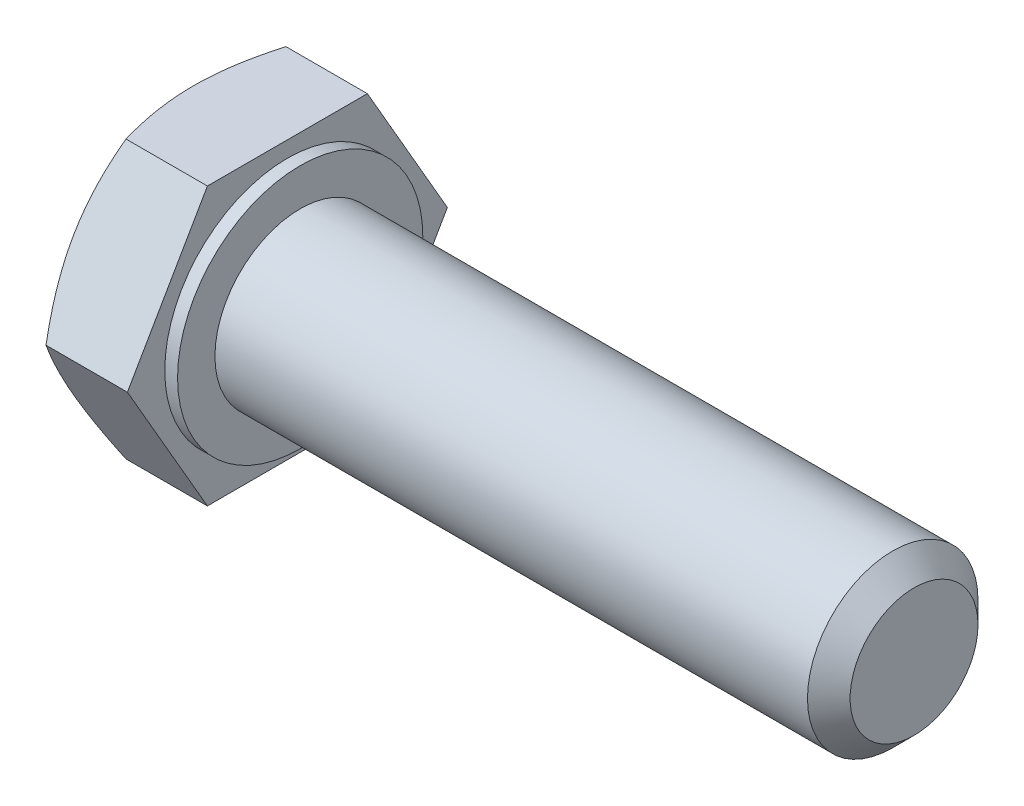
ISO-10303-21;
HEADER;
FILE_DESCRIPTION(('STEP AP214'),'2;1');
FILE_NAME('part.step','',(''),(''),'','','');
FILE_SCHEMA(('AUTOMOTIVE_DESIGN { 1 0 10303 214 1 1 1 1 }'));
ENDSEC;
DATA;
#1=APPLICATION_CONTEXT('core data for automotive mechanical design processes');
#2=APPLICATION_PROTOCOL_DEFINITION('international standard','automotive_design',2000,#1);
#3=PRODUCT_CONTEXT('',#1,'mechanical');
#4=PRODUCT('Part','Part','',(#3));
#5=PRODUCT_RELATED_PRODUCT_CATEGORY('part','',(#4));
#6=PRODUCT_DEFINITION_FORMATION('','',#4);
#7=PRODUCT_DEFINITION_CONTEXT('part definition',#1,'design');
#8=PRODUCT_DEFINITION('design','',#6,#7);
#9=PRODUCT_DEFINITION_SHAPE('','',#8);
#10=(LENGTH_UNIT() NAMED_UNIT(*) SI_UNIT(.MILLI.,.METRE.));
#11=(NAMED_UNIT(*) PLANE_ANGLE_UNIT() SI_UNIT($,.RADIAN.));
#12=(NAMED_UNIT(*) SI_UNIT($,.STERADIAN.) SOLID_ANGLE_UNIT());
#13=UNCERTAINTY_MEASURE_WITH_UNIT(LENGTH_MEASURE(1.E-05),#10,'distance_accuracy_value','');
#14=(GEOMETRIC_REPRESENTATION_CONTEXT(3) GLOBAL_UNCERTAINTY_ASSIGNED_CONTEXT((#13)) GLOBAL_UNIT_ASSIGNED_CONTEXT((#10,
#11,#12)) REPRESENTATION_CONTEXT('',''));
#15=CARTESIAN_POINT('',(0.,0.,0.));
#16=DIRECTION('',(0.,0.,1.));
#17=DIRECTION('',(1.,0.,0.));
#18=AXIS2_PLACEMENT_3D('',#15,#16,#17);
#19=CARTESIAN_POINT('',(0.,0.,0.));
#20=DIRECTION('',(-1.,0.,0.));
#21=DIRECTION('',(0.,0.,1.));
#22=AXIS2_PLACEMENT_3D('',#19,#20,#21);
#23=CYLINDRICAL_SURFACE('',#22,4.);
#24=CARTESIAN_POINT('',(27.8,0.,0.));
#25=DIRECTION('',(1.,0.,0.));
#26=DIRECTION('',(0.,0.,-1.));
#27=AXIS2_PLACEMENT_3D('',#24,#25,#26);
#28=CIRCLE('',#27,4.);
#29=CARTESIAN_POINT('',(27.8,0.,-4.));
#30=VERTEX_POINT('',#29);
#31=EDGE_CURVE('E60',#30,#30,#28,.F.);
#32=ORIENTED_EDGE('',*,*,#31,.T.);
#33=EDGE_LOOP('',(#32));
#34=FACE_BOUND('',#33,.T.);
#35=CARTESIAN_POINT('',(0.,0.,0.));
#36=DIRECTION('',(-1.,0.,0.));
#37=DIRECTION('',(0.,0.,1.));
#38=AXIS2_PLACEMENT_3D('',#35,#36,#37);
#39=CIRCLE('',#38,4.);
#40=CARTESIAN_POINT('',(0.,0.,4.));
#41=VERTEX_POINT('',#40);
#42=EDGE_CURVE('E332',#41,#41,#39,.T.);
#43=ORIENTED_EDGE('',*,*,#42,.F.);
#44=EDGE_LOOP('',(#43));
#45=FACE_BOUND('',#44,.T.);
#46=ADVANCED_FACE('F50',(#34,#45),#23,.T.);
#47=CARTESIAN_POINT('',(5.,-3.25,-5.62916512459885));
#48=DIRECTION('',(0.,-0.5,-0.866025403784439));
#49=DIRECTION('',(0.,-0.866025403784439,0.5));
#50=AXIS2_PLACEMENT_3D('',#47,#48,#49);
#51=PLANE('',#50);
#52=CARTESIAN_POINT('',(-4.41944341639923,-6.5,-3.75277674973256));
#53=CARTESIAN_POINT('',(-4.70121119604599,-5.65469666106237,-4.24081286001509));
#54=CARTESIAN_POINT('',(-4.8436671491988,-4.89166385268633,-4.68135005733152));
#55=CARTESIAN_POINT('',(-5.00000000000001,-4.05430260839823,-5.16480079713021));
#56=CARTESIAN_POINT('',(-5.00000000000001,-3.25,-5.62916512459885));
#57=B_SPLINE_CURVE_WITH_KNOTS('',2,(#52,#53,#54,#55,#56),.UNSPECIFIED.,.F.,.F.,(3,2,3),(0.,0.5,
1.),.UNSPECIFIED.);
#58=CARTESIAN_POINT('',(-4.41944341639924,-6.5,-3.75277674973257));
#59=VERTEX_POINT('',#58);
#60=CARTESIAN_POINT('',(-5.,-3.25,-5.62916512459885));
#61=VERTEX_POINT('',#60);
#62=EDGE_CURVE('E481',#59,#61,#57,.T.);
#63=ORIENTED_EDGE('',*,*,#62,.T.);
#64=CARTESIAN_POINT('',(-5.00000000000001,-3.25,-5.62916512459885));
#65=CARTESIAN_POINT('',(-5.00000000000001,-2.44516175632983,-6.09383870123593));
#66=CARTESIAN_POINT('',(-4.84328039134563,-1.60626522925935,-6.57817583696231));
#67=CARTESIAN_POINT('',(-4.70100428714806,-0.844682612245119,-7.01787576590562));
#68=CARTESIAN_POINT('',(-4.41944341639923,0.,-7.50555349946513));
#69=B_SPLINE_CURVE_WITH_KNOTS('',2,(#64,#65,#66,#67,#68),.UNSPECIFIED.,.F.,.F.,(3,2,3),(0.,0.5,
1.),.UNSPECIFIED.);
#70=CARTESIAN_POINT('',(-4.41944341639924,0.,-7.50555349946513));
#71=VERTEX_POINT('',#70);
#72=EDGE_CURVE('E512',#61,#71,#69,.T.);
#73=ORIENTED_EDGE('',*,*,#72,.T.);
#74=DIRECTION('',(-1.,0.,0.));
#75=VECTOR('',#74,1.);
#76=CARTESIAN_POINT('',(5.,0.,-7.50555349946513));
#77=LINE('',#76,#75);
#78=CARTESIAN_POINT('',(-0.6,0.,-7.50555349946513));
#79=VERTEX_POINT('',#78);
#80=EDGE_CURVE('E297',#79,#71,#77,.T.);
#81=ORIENTED_EDGE('',*,*,#80,.F.);
#82=DIRECTION('',(0.,-0.866025403784439,0.5));
#83=VECTOR('',#82,1.);
#84=CARTESIAN_POINT('',(-0.6,2.37916512459885,-8.87916512459885));
#85=LINE('',#84,#83);
#86=CARTESIAN_POINT('',(-0.6,-6.5,-3.75277674973257));
#87=VERTEX_POINT('',#86);
#88=EDGE_CURVE('E338',#79,#87,#85,.T.);
#89=ORIENTED_EDGE('',*,*,#88,.T.);
#90=DIRECTION('',(-1.,0.,0.));
#91=VECTOR('',#90,1.);
#92=CARTESIAN_POINT('',(5.,-6.5,-3.75277674973257));
#93=LINE('',#92,#91);
#94=EDGE_CURVE('E165',#87,#59,#93,.T.);
#95=ORIENTED_EDGE('',*,*,#94,.T.);
#96=EDGE_LOOP('',(#63,#73,#81,#89,#95));
#97=FACE_BOUND('',#96,.T.);
#98=ADVANCED_FACE('F487',(#97),#51,.T.);
#99=CARTESIAN_POINT('',(5.,-6.5,0.));
#100=DIRECTION('',(0.,-1.,0.));
#101=DIRECTION('',(0.,0.,-1.));
#102=AXIS2_PLACEMENT_3D('',#99,#100,#101);
#103=PLANE('',#102);
#104=CARTESIAN_POINT('',(-4.41944341639923,-6.5,3.75277674973257));
#105=CARTESIAN_POINT('',(-4.69982369058349,-6.5,2.78151098907814));
#106=CARTESIAN_POINT('',(-4.8422378147998,-6.5,1.90445380224231));
#107=CARTESIAN_POINT('',(-5.,-6.5,0.932875603084308));
#108=CARTESIAN_POINT('',(-5.,-6.5,0.));
#109=B_SPLINE_CURVE_WITH_KNOTS('',2,(#104,#105,#106,#107,#108),.UNSPECIFIED.,.F.,.F.,(3,2,3),
(0.,0.5,1.),.UNSPECIFIED.);
#110=CARTESIAN_POINT('',(-4.41944341639924,-6.5,3.75277674973257));
#111=VERTEX_POINT('',#110);
#112=CARTESIAN_POINT('',(-5.,-6.5,0.));
#113=VERTEX_POINT('',#112);
#114=EDGE_CURVE('E156',#111,#113,#109,.T.);
#115=ORIENTED_EDGE('',*,*,#114,.T.);
#116=CARTESIAN_POINT('',(-5.,-6.5,0.));
#117=CARTESIAN_POINT('',(-5.,-6.5,-0.925923553281648));
#118=CARTESIAN_POINT('',(-4.84445525213694,-6.5,-1.89074873679831));
#119=CARTESIAN_POINT('',(-4.70214945928393,-6.5,-2.77345428996665));
#120=CARTESIAN_POINT('',(-4.41944341639923,-6.5,-3.75277674973257));
#121=B_SPLINE_CURVE_WITH_KNOTS('',2,(#116,#117,#118,#119,#120),.UNSPECIFIED.,.F.,.F.,(3,2,3),
(0.,0.5,1.),.UNSPECIFIED.);
#122=EDGE_CURVE('E526',#113,#59,#121,.T.);
#123=ORIENTED_EDGE('',*,*,#122,.T.);
#124=ORIENTED_EDGE('',*,*,#94,.F.);
#125=DIRECTION('',(0.,0.,1.));
#126=VECTOR('',#125,1.);
#127=CARTESIAN_POINT('',(-0.6,-6.5,0.));
#128=LINE('',#127,#126);
#129=CARTESIAN_POINT('',(-0.6,-6.5,3.75277674973257));
#130=VERTEX_POINT('',#129);
#131=EDGE_CURVE('E160',#87,#130,#128,.T.);
#132=ORIENTED_EDGE('',*,*,#131,.T.);
#133=DIRECTION('',(-1.,0.,0.));
#134=VECTOR('',#133,1.);
#135=CARTESIAN_POINT('',(5.,-6.5,3.75277674973257));
#136=LINE('',#135,#134);
#137=EDGE_CURVE('E151',#130,#111,#136,.T.);
#138=ORIENTED_EDGE('',*,*,#137,.T.);
#139=EDGE_LOOP('',(#115,#123,#124,#132,#138));
#140=FACE_BOUND('',#139,.T.);
#141=ADVANCED_FACE('F153',(#140),#103,.T.);
#142=CARTESIAN_POINT('',(5.,-3.25,5.62916512459885));
#143=DIRECTION('',(0.,-0.5,0.866025403784439));
#144=DIRECTION('',(-1.,0.,0.));
#145=AXIS2_PLACEMENT_3D('',#142,#143,#144);
#146=PLANE('',#145);
#147=CARTESIAN_POINT('',(-4.41944341639923,0.,7.50555349946513));
#148=CARTESIAN_POINT('',(-4.70121119604632,-0.845303338938597,7.01751738918205));
#149=CARTESIAN_POINT('',(-4.8436671491988,-1.60833614731368,6.57698019186617));
#150=CARTESIAN_POINT('',(-5.,-2.44569739160262,6.093529452067));
#151=CARTESIAN_POINT('',(-5.,-3.25,5.62916512459885));
#152=B_SPLINE_CURVE_WITH_KNOTS('',2,(#147,#148,#149,#150,#151),.UNSPECIFIED.,.F.,.F.,(3,2,3),
(0.,0.5,1.),.UNSPECIFIED.);
#153=CARTESIAN_POINT('',(-4.41944341639924,0.,7.50555349946513));
#154=VERTEX_POINT('',#153);
#155=CARTESIAN_POINT('',(-5.,-3.25,5.62916512459885));
#156=VERTEX_POINT('',#155);
#157=EDGE_CURVE('E174',#154,#156,#152,.T.);
#158=ORIENTED_EDGE('',*,*,#157,.T.);
#159=CARTESIAN_POINT('',(-5.,-3.25,5.62916512459885));
#160=CARTESIAN_POINT('',(-5.,-4.05483824367016,5.16449154796178));
#161=CARTESIAN_POINT('',(-4.84328039134562,-4.89373477074065,4.68015441223539));
#162=CARTESIAN_POINT('',(-4.70100428714806,-5.65531738775488,4.24045448329208));
#163=CARTESIAN_POINT('',(-4.41944341639923,-6.5,3.75277674973256));
#164=B_SPLINE_CURVE_WITH_KNOTS('',2,(#159,#160,#161,#162,#163),.UNSPECIFIED.,.F.,.F.,(3,2,3),
(0.,0.5,1.),.UNSPECIFIED.);
#165=EDGE_CURVE('E170',#156,#111,#164,.T.);
#166=ORIENTED_EDGE('',*,*,#165,.T.);
#167=ORIENTED_EDGE('',*,*,#137,.F.);
#168=DIRECTION('',(0.,0.866025403784439,0.5));
#169=VECTOR('',#168,1.);
#170=CARTESIAN_POINT('',(-0.6,2.37916512459886,8.87916512459885));
#171=LINE('',#170,#169);
#172=CARTESIAN_POINT('',(-0.6,0.,7.50555349946513));
#173=VERTEX_POINT('',#172);
#174=EDGE_CURVE('E411',#130,#173,#171,.T.);
#175=ORIENTED_EDGE('',*,*,#174,.T.);
#176=DIRECTION('',(-1.,0.,0.));
#177=VECTOR('',#176,1.);
#178=CARTESIAN_POINT('',(5.,0.,7.50555349946513));
#179=LINE('',#178,#177);
#180=EDGE_CURVE('E166',#173,#154,#179,.T.);
#181=ORIENTED_EDGE('',*,*,#180,.T.);
#182=EDGE_LOOP('',(#158,#166,#167,#175,#181));
#183=FACE_BOUND('',#182,.T.);
#184=ADVANCED_FACE('F172',(#183),#146,.T.);
#185=CARTESIAN_POINT('',(5.,3.25,5.62916512459885));
#186=DIRECTION('',(0.,0.5,0.866025403784439));
#187=DIRECTION('',(1.,0.,0.));
#188=AXIS2_PLACEMENT_3D('',#185,#186,#187);
#189=PLANE('',#188);
#190=CARTESIAN_POINT('',(-4.41944341639923,6.5,3.75277674973256));
#191=CARTESIAN_POINT('',(-4.70121119604948,5.65469666105194,4.24081286002112));
#192=CARTESIAN_POINT('',(-4.8436671491988,4.89166385268633,4.68135005733152));
#193=CARTESIAN_POINT('',(-5.,4.05430260838919,5.16480079713543));
#194=CARTESIAN_POINT('',(-5.,3.25,5.62916512459885));
#195=B_SPLINE_CURVE_WITH_KNOTS('',2,(#190,#191,#192,#193,#194),.UNSPECIFIED.,.F.,.F.,(3,2,3),
(0.,0.5,1.),.UNSPECIFIED.);
#196=CARTESIAN_POINT('',(-4.41944341639924,6.5,3.75277674973256));
#197=VERTEX_POINT('',#196);
#198=CARTESIAN_POINT('',(-5.,3.25,5.62916512459885));
#199=VERTEX_POINT('',#198);
#200=EDGE_CURVE('E357',#197,#199,#195,.T.);
#201=ORIENTED_EDGE('',*,*,#200,.T.);
#202=CARTESIAN_POINT('',(-5.,3.25,5.62916512459885));
#203=CARTESIAN_POINT('',(-5.,2.44516175633737,6.09383870123157));
#204=CARTESIAN_POINT('',(-4.84328039134562,1.60626522925936,6.57817583696231));
#205=CARTESIAN_POINT('',(-4.70100428715097,0.844682612253839,7.01787576590058));
#206=CARTESIAN_POINT('',(-4.41944341639923,0.,7.50555349946513));
#207=B_SPLINE_CURVE_WITH_KNOTS('',2,(#202,#203,#204,#205,#206),.UNSPECIFIED.,.F.,.F.,(3,2,3),
(0.,0.5,1.),.UNSPECIFIED.);
#208=EDGE_CURVE('E347',#199,#154,#207,.T.);
#209=ORIENTED_EDGE('',*,*,#208,.T.);
#210=ORIENTED_EDGE('',*,*,#180,.F.);
#211=DIRECTION('',(0.,0.866025403784439,-0.5));
#212=VECTOR('',#211,1.);
#213=CARTESIAN_POINT('',(-0.6,8.87916512459885,2.37916512459886));
#214=LINE('',#213,#212);
#215=CARTESIAN_POINT('',(-0.6,6.5,3.75277674973256));
#216=VERTEX_POINT('',#215);
#217=EDGE_CURVE('E414',#173,#216,#214,.T.);
#218=ORIENTED_EDGE('',*,*,#217,.T.);
#219=DIRECTION('',(-1.,0.,0.));
#220=VECTOR('',#219,1.);
#221=CARTESIAN_POINT('',(5.,6.5,3.75277674973256));
#222=LINE('',#221,#220);
#223=EDGE_CURVE('E334',#216,#197,#222,.T.);
#224=ORIENTED_EDGE('',*,*,#223,.T.);
#225=EDGE_LOOP('',(#201,#209,#210,#218,#224));
#226=FACE_BOUND('',#225,.T.);
#227=ADVANCED_FACE('F280',(#226),#189,.T.);
#228=CARTESIAN_POINT('',(5.,6.5,0.));
#229=DIRECTION('',(0.,1.,0.));
#230=DIRECTION('',(0.,0.,-1.));
#231=AXIS2_PLACEMENT_3D('',#228,#229,#230);
#232=PLANE('',#231);
#233=CARTESIAN_POINT('',(-4.41944341639923,6.5,-3.75277674973257));
#234=CARTESIAN_POINT('',(-4.70197801965467,6.5,-2.77404817426324));
#235=CARTESIAN_POINT('',(-4.84445525213694,6.5,-1.89074873679831));
#236=CARTESIAN_POINT('',(-5.,6.5,-0.926436152293465));
#237=CARTESIAN_POINT('',(-5.,6.5,0.));
#238=B_SPLINE_CURVE_WITH_KNOTS('',2,(#233,#234,#235,#236,#237),.UNSPECIFIED.,.F.,.F.,(3,2,3),
(0.,0.5,1.),.UNSPECIFIED.);
#239=CARTESIAN_POINT('',(-4.41944341639924,6.5,-3.75277674973257));
#240=VERTEX_POINT('',#239);
#241=CARTESIAN_POINT('',(-5.,6.5,0.));
#242=VERTEX_POINT('',#241);
#243=EDGE_CURVE('E258',#240,#242,#238,.T.);
#244=ORIENTED_EDGE('',*,*,#243,.T.);
#245=CARTESIAN_POINT('',(-5.,6.5,0.));
#246=CARTESIAN_POINT('',(-5.,6.5,0.932359564463872));
#247=CARTESIAN_POINT('',(-4.8422378147998,6.5,1.90445380224232));
#248=CARTESIAN_POINT('',(-4.69999637130595,6.5,2.78091280550854));
#249=CARTESIAN_POINT('',(-4.41944341639923,6.5,3.75277674973257));
#250=B_SPLINE_CURVE_WITH_KNOTS('',2,(#245,#246,#247,#248,#249),.UNSPECIFIED.,.F.,.F.,(3,2,3),
(0.,0.5,1.),.UNSPECIFIED.);
#251=EDGE_CURVE('E259',#242,#197,#250,.T.);
#252=ORIENTED_EDGE('',*,*,#251,.T.);
#253=ORIENTED_EDGE('',*,*,#223,.F.);
#254=DIRECTION('',(0.,0.,-1.));
#255=VECTOR('',#254,1.);
#256=CARTESIAN_POINT('',(-0.6,6.5,0.));
#257=LINE('',#256,#255);
#258=CARTESIAN_POINT('',(-0.6,6.5,-3.75277674973257));
#259=VERTEX_POINT('',#258);
#260=EDGE_CURVE('E417',#216,#259,#257,.T.);
#261=ORIENTED_EDGE('',*,*,#260,.T.);
#262=DIRECTION('',(-1.,0.,0.));
#263=VECTOR('',#262,1.);
#264=CARTESIAN_POINT('',(5.,6.5,-3.75277674973257));
#265=LINE('',#264,#263);
#266=EDGE_CURVE('E71',#259,#240,#265,.T.);
#267=ORIENTED_EDGE('',*,*,#266,.T.);
#268=EDGE_LOOP('',(#244,#252,#253,#261,#267));
#269=FACE_BOUND('',#268,.T.);
#270=ADVANCED_FACE('F270',(#269),#232,.T.);
#271=CARTESIAN_POINT('',(5.,3.25,-5.62916512459885));
#272=DIRECTION('',(0.,0.5,-0.866025403784439));
#273=DIRECTION('',(-1.,0.,0.));
#274=AXIS2_PLACEMENT_3D('',#271,#272,#273);
#275=PLANE('',#274);
#276=CARTESIAN_POINT('',(-4.41944341639923,0.,-7.50555349946513));
#277=CARTESIAN_POINT('',(-4.70121119604626,0.845303338938406,-7.01751738918215));
#278=CARTESIAN_POINT('',(-4.8436671491988,1.60833614731367,-6.57698019186618));
#279=CARTESIAN_POINT('',(-5.,2.44569739160245,-6.09352945206709));
#280=CARTESIAN_POINT('',(-5.,3.25,-5.62916512459885));
#281=B_SPLINE_CURVE_WITH_KNOTS('',2,(#276,#277,#278,#279,#280),.UNSPECIFIED.,.F.,.F.,(3,2,3),
(0.,0.5,1.),.UNSPECIFIED.);
#282=CARTESIAN_POINT('',(-5.,3.25,-5.62916512459885));
#283=VERTEX_POINT('',#282);
#284=EDGE_CURVE('E305',#71,#283,#281,.T.);
#285=ORIENTED_EDGE('',*,*,#284,.T.);
#286=CARTESIAN_POINT('',(-5.,3.25,-5.62916512459885));
#287=CARTESIAN_POINT('',(-5.,4.05483824367083,-5.16449154796139));
#288=CARTESIAN_POINT('',(-4.84328039134562,4.89373477074065,-4.68015441223539));
#289=CARTESIAN_POINT('',(-4.7010042871478,5.65531738775564,-4.24045448329164));
#290=CARTESIAN_POINT('',(-4.41944341639923,6.5,-3.75277674973256));
#291=B_SPLINE_CURVE_WITH_KNOTS('',2,(#286,#287,#288,#289,#290),.UNSPECIFIED.,.F.,.F.,(3,2,3),
(0.,0.5,1.),.UNSPECIFIED.);
#292=EDGE_CURVE('E309',#283,#240,#291,.T.);
#293=ORIENTED_EDGE('',*,*,#292,.T.);
#294=ORIENTED_EDGE('',*,*,#266,.F.);
#295=DIRECTION('',(0.,-0.866025403784439,-0.5));
#296=VECTOR('',#295,1.);
#297=CARTESIAN_POINT('',(-0.6,8.87916512459885,-2.37916512459886));
#298=LINE('',#297,#296);
#299=EDGE_CURVE('E342',#259,#79,#298,.T.);
#300=ORIENTED_EDGE('',*,*,#299,.T.);
#301=ORIENTED_EDGE('',*,*,#80,.T.);
#302=EDGE_LOOP('',(#285,#293,#294,#300,#301));
#303=FACE_BOUND('',#302,.T.);
#304=ADVANCED_FACE('F279',(#303),#275,.T.);
#305=CARTESIAN_POINT('',(-5.,0.,0.));
#306=DIRECTION('',(1.,0.,0.));
#307=DIRECTION('',(0.,1.,0.));
#308=AXIS2_PLACEMENT_3D('',#305,#306,#307);
#309=PLANE('',#308);
#310=CARTESIAN_POINT('',(-5.,0.,0.));
#311=DIRECTION('',(-1.,0.,0.));
#312=DIRECTION('',(0.,0.,1.));
#313=AXIS2_PLACEMENT_3D('',#310,#311,#312);
#314=CIRCLE('',#313,6.5);
#315=EDGE_CURVE('E301',#283,#61,#314,.T.);
#316=ORIENTED_EDGE('',*,*,#315,.T.);
#317=CARTESIAN_POINT('',(-5.,0.,0.));
#318=DIRECTION('',(-1.,0.,0.));
#319=DIRECTION('',(0.,0.,1.));
#320=AXIS2_PLACEMENT_3D('',#317,#318,#319);
#321=CIRCLE('',#320,6.5);
#322=EDGE_CURVE('E195',#61,#113,#321,.T.);
#323=ORIENTED_EDGE('',*,*,#322,.T.);
#324=CARTESIAN_POINT('',(-5.,0.,0.));
#325=DIRECTION('',(-1.,0.,0.));
#326=DIRECTION('',(0.,0.,1.));
#327=AXIS2_PLACEMENT_3D('',#324,#325,#326);
#328=CIRCLE('',#327,6.5);
#329=EDGE_CURVE('E180',#113,#156,#328,.T.);
#330=ORIENTED_EDGE('',*,*,#329,.T.);
#331=CARTESIAN_POINT('',(-5.,0.,0.));
#332=DIRECTION('',(-1.,0.,0.));
#333=DIRECTION('',(0.,0.,1.));
#334=AXIS2_PLACEMENT_3D('',#331,#332,#333);
#335=CIRCLE('',#334,6.5);
#336=EDGE_CURVE('E350',#156,#199,#335,.T.);
#337=ORIENTED_EDGE('',*,*,#336,.T.);
#338=CARTESIAN_POINT('',(-5.,0.,0.));
#339=DIRECTION('',(-1.,0.,0.));
#340=DIRECTION('',(0.,0.,1.));
#341=AXIS2_PLACEMENT_3D('',#338,#339,#340);
#342=CIRCLE('',#341,6.5);
#343=EDGE_CURVE('E249',#199,#242,#342,.T.);
#344=ORIENTED_EDGE('',*,*,#343,.T.);
#345=CARTESIAN_POINT('',(-5.,0.,0.));
#346=DIRECTION('',(-1.,0.,0.));
#347=DIRECTION('',(0.,0.,1.));
#348=AXIS2_PLACEMENT_3D('',#345,#346,#347);
#349=CIRCLE('',#348,6.5);
#350=EDGE_CURVE('E298',#242,#283,#349,.T.);
#351=ORIENTED_EDGE('',*,*,#350,.T.);
#352=EDGE_LOOP('',(#316,#323,#330,#337,#344,#351));
#353=FACE_BOUND('',#352,.T.);
#354=ADVANCED_FACE('F437',(#353),#309,.F.);
#355=CARTESIAN_POINT('',(0.,5.75277674973257,0.));
#356=DIRECTION('',(-1.,0.,0.));
#357=DIRECTION('',(0.,0.,1.));
#358=AXIS2_PLACEMENT_3D('',#355,#356,#357);
#359=PLANE('',#358);
#360=ORIENTED_EDGE('',*,*,#42,.T.);
#361=EDGE_LOOP('',(#360));
#362=FACE_BOUND('',#361,.T.);
#363=CARTESIAN_POINT('',(0.,0.,0.));
#364=DIRECTION('',(-1.,0.,0.));
#365=DIRECTION('',(0.,0.,1.));
#366=AXIS2_PLACEMENT_3D('',#363,#364,#365);
#367=CIRCLE('',#366,5.75277674973257);
#368=CARTESIAN_POINT('',(0.,0.,-5.75277674973257));
#369=VERTEX_POINT('',#368);
#370=EDGE_CURVE('E328',#369,#369,#367,.T.);
#371=ORIENTED_EDGE('',*,*,#370,.F.);
#372=EDGE_LOOP('',(#371));
#373=FACE_BOUND('',#372,.T.);
#374=ADVANCED_FACE('F233',(#362,#373),#359,.F.);
#375=CARTESIAN_POINT('',(-4.41944341639924,0.,0.));
#376=DIRECTION('',(1.,0.,0.));
#377=DIRECTION('',(0.,0.,-1.));
#378=AXIS2_PLACEMENT_3D('',#375,#376,#377);
#379=CONICAL_SURFACE('',#378,7.50555349946513,1.0471975511966);
#380=ORIENTED_EDGE('',*,*,#243,.F.);
#381=ORIENTED_EDGE('',*,*,#292,.F.);
#382=ORIENTED_EDGE('',*,*,#350,.F.);
#383=EDGE_LOOP('',(#380,#381,#382));
#384=FACE_BOUND('',#383,.T.);
#385=ADVANCED_FACE('F210',(#384),#379,.T.);
#386=CARTESIAN_POINT('',(-4.41944341639924,0.,0.));
#387=DIRECTION('',(1.,0.,0.));
#388=DIRECTION('',(0.,0.,-1.));
#389=AXIS2_PLACEMENT_3D('',#386,#387,#388);
#390=CONICAL_SURFACE('',#389,7.50555349946513,1.0471975511966);
#391=ORIENTED_EDGE('',*,*,#200,.F.);
#392=ORIENTED_EDGE('',*,*,#251,.F.);
#393=ORIENTED_EDGE('',*,*,#343,.F.);
#394=EDGE_LOOP('',(#391,#392,#393));
#395=FACE_BOUND('',#394,.T.);
#396=ADVANCED_FACE('F232',(#395),#390,.T.);
#397=CARTESIAN_POINT('',(-4.41944341639924,0.,0.));
#398=DIRECTION('',(1.,0.,0.));
#399=DIRECTION('',(0.,0.,-1.));
#400=AXIS2_PLACEMENT_3D('',#397,#398,#399);
#401=CONICAL_SURFACE('',#400,7.50555349946513,1.0471975511966);
#402=ORIENTED_EDGE('',*,*,#157,.F.);
#403=ORIENTED_EDGE('',*,*,#208,.F.);
#404=ORIENTED_EDGE('',*,*,#336,.F.);
#405=EDGE_LOOP('',(#402,#403,#404));
#406=FACE_BOUND('',#405,.T.);
#407=ADVANCED_FACE('F207',(#406),#401,.T.);
#408=CARTESIAN_POINT('',(-4.41944341639924,0.,0.));
#409=DIRECTION('',(1.,0.,0.));
#410=DIRECTION('',(0.,0.,-1.));
#411=AXIS2_PLACEMENT_3D('',#408,#409,#410);
#412=CONICAL_SURFACE('',#411,7.50555349946513,1.0471975511966);
#413=ORIENTED_EDGE('',*,*,#114,.F.);
#414=ORIENTED_EDGE('',*,*,#165,.F.);
#415=ORIENTED_EDGE('',*,*,#329,.F.);
#416=EDGE_LOOP('',(#413,#414,#415));
#417=FACE_BOUND('',#416,.T.);
#418=ADVANCED_FACE('F184',(#417),#412,.T.);
#419=CARTESIAN_POINT('',(-0.6,7.50555349946513,0.));
#420=DIRECTION('',(-1.,0.,0.));
#421=DIRECTION('',(0.,0.,1.));
#422=AXIS2_PLACEMENT_3D('',#419,#420,#421);
#423=PLANE('',#422);
#424=CARTESIAN_POINT('',(-0.6,0.,0.));
#425=DIRECTION('',(-1.,0.,0.));
#426=DIRECTION('',(0.,0.,1.));
#427=AXIS2_PLACEMENT_3D('',#424,#425,#426);
#428=CIRCLE('',#427,5.75277674973257);
#429=CARTESIAN_POINT('',(-0.6,0.,5.75277674973257));
#430=VERTEX_POINT('',#429);
#431=EDGE_CURVE('E306',#430,#430,#428,.T.);
#432=ORIENTED_EDGE('',*,*,#431,.T.);
#433=EDGE_LOOP('',(#432));
#434=FACE_BOUND('',#433,.T.);
#435=ORIENTED_EDGE('',*,*,#88,.F.);
#436=ORIENTED_EDGE('',*,*,#299,.F.);
#437=ORIENTED_EDGE('',*,*,#260,.F.);
#438=ORIENTED_EDGE('',*,*,#217,.F.);
#439=ORIENTED_EDGE('',*,*,#174,.F.);
#440=ORIENTED_EDGE('',*,*,#131,.F.);
#441=EDGE_LOOP('',(#435,#436,#437,#438,#439,#440));
#442=FACE_BOUND('',#441,.T.);
#443=ADVANCED_FACE('F206',(#434,#442),#423,.F.);
#444=CARTESIAN_POINT('',(-4.41944341639924,0.,0.));
#445=DIRECTION('',(1.,0.,0.));
#446=DIRECTION('',(0.,0.,-1.));
#447=AXIS2_PLACEMENT_3D('',#444,#445,#446);
#448=CONICAL_SURFACE('',#447,7.50555349946513,1.0471975511966);
#449=ORIENTED_EDGE('',*,*,#62,.F.);
#450=ORIENTED_EDGE('',*,*,#122,.F.);
#451=ORIENTED_EDGE('',*,*,#322,.F.);
#452=EDGE_LOOP('',(#449,#450,#451));
#453=FACE_BOUND('',#452,.T.);
#454=ADVANCED_FACE('F281',(#453),#448,.T.);
#455=CARTESIAN_POINT('',(-4.41944341639924,0.,0.));
#456=DIRECTION('',(1.,0.,0.));
#457=DIRECTION('',(0.,0.,-1.));
#458=AXIS2_PLACEMENT_3D('',#455,#456,#457);
#459=CONICAL_SURFACE('',#458,7.50555349946513,1.0471975511966);
#460=ORIENTED_EDGE('',*,*,#315,.F.);
#461=ORIENTED_EDGE('',*,*,#284,.F.);
#462=ORIENTED_EDGE('',*,*,#72,.F.);
#463=EDGE_LOOP('',(#460,#461,#462));
#464=FACE_BOUND('',#463,.T.);
#465=ADVANCED_FACE('F384',(#464),#459,.T.);
#466=CARTESIAN_POINT('',(0.,0.,0.));
#467=DIRECTION('',(-1.,0.,0.));
#468=DIRECTION('',(0.,0.,1.));
#469=AXIS2_PLACEMENT_3D('',#466,#467,#468);
#470=CYLINDRICAL_SURFACE('',#469,5.75277674973257);
#471=ORIENTED_EDGE('',*,*,#431,.F.);
#472=EDGE_LOOP('',(#471));
#473=FACE_BOUND('',#472,.T.);
#474=ORIENTED_EDGE('',*,*,#370,.T.);
#475=EDGE_LOOP('',(#474));
#476=FACE_BOUND('',#475,.T.);
#477=ADVANCED_FACE('F549',(#473,#476),#470,.T.);
#478=CARTESIAN_POINT('',(28.8,0.,0.));
#479=DIRECTION('',(1.,0.,0.));
#480=DIRECTION('',(0.,0.,-1.));
#481=AXIS2_PLACEMENT_3D('',#478,#479,#480);
#482=PLANE('',#481);
#483=CARTESIAN_POINT('',(28.8,0.,0.));
#484=DIRECTION('',(1.,0.,0.));
#485=DIRECTION('',(0.,0.,-1.));
#486=AXIS2_PLACEMENT_3D('',#483,#484,#485);
#487=CIRCLE('',#486,2.99999999999999);
#488=CARTESIAN_POINT('',(28.8,0.,-2.99999999999999));
#489=VERTEX_POINT('',#488);
#490=EDGE_CURVE('E11',#489,#489,#487,.T.);
#491=ORIENTED_EDGE('',*,*,#490,.T.);
#492=EDGE_LOOP('',(#491));
#493=FACE_BOUND('',#492,.T.);
#494=ADVANCED_FACE('F497',(#493),#482,.T.);
#495=CARTESIAN_POINT('',(27.8,0.,0.));
#496=DIRECTION('',(-1.,0.,0.));
#497=DIRECTION('',(0.,0.,1.));
#498=AXIS2_PLACEMENT_3D('',#495,#496,#497);
#499=CONICAL_SURFACE('',#498,4.,0.785398163397452);
#500=ORIENTED_EDGE('',*,*,#490,.F.);
#501=EDGE_LOOP('',(#500));
#502=FACE_BOUND('',#501,.T.);
#503=ORIENTED_EDGE('',*,*,#31,.F.);
#504=EDGE_LOOP('',(#503));
#505=FACE_BOUND('',#504,.T.);
#506=ADVANCED_FACE('F53',(#502,#505),#499,.T.);
#507=CLOSED_SHELL('',(#46,#98,#141,#184,#227,#270,#304,#354,#374,#385,#396,#407,#418,#443,#454,
#465,#477,#494,#506));
#508=MANIFOLD_SOLID_BREP('B2',#507);
#509=ADVANCED_BREP_SHAPE_REPRESENTATION('',(#18,#508),#14);
#510=SHAPE_DEFINITION_REPRESENTATION(#9,#509);
ENDSEC;
END-ISO-10303-21;
